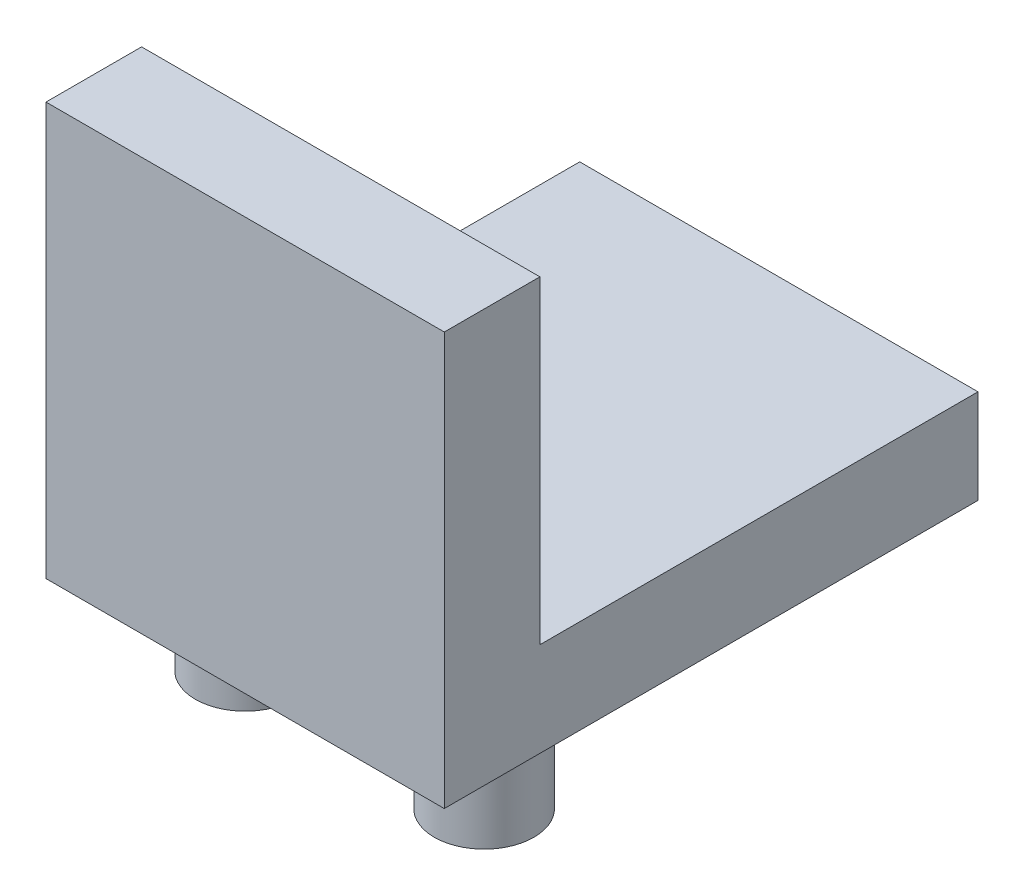
ISO-10303-21;
HEADER;
FILE_DESCRIPTION(('STEP AP214'),'2;1');
FILE_NAME('part.step','',(''),(''),'','','');
FILE_SCHEMA(('AUTOMOTIVE_DESIGN { 1 0 10303 214 1 1 1 1 }'));
ENDSEC;
DATA;
#1=APPLICATION_CONTEXT('core data for automotive mechanical design processes');
#2=APPLICATION_PROTOCOL_DEFINITION('international standard','automotive_design',2000,#1);
#3=PRODUCT_CONTEXT('',#1,'mechanical');
#4=PRODUCT('Part','Part','',(#3));
#5=PRODUCT_RELATED_PRODUCT_CATEGORY('part','',(#4));
#6=PRODUCT_DEFINITION_FORMATION('','',#4);
#7=PRODUCT_DEFINITION_CONTEXT('part definition',#1,'design');
#8=PRODUCT_DEFINITION('design','',#6,#7);
#9=PRODUCT_DEFINITION_SHAPE('','',#8);
#10=(LENGTH_UNIT() NAMED_UNIT(*) SI_UNIT(.MILLI.,.METRE.));
#11=(NAMED_UNIT(*) PLANE_ANGLE_UNIT() SI_UNIT($,.RADIAN.));
#12=(NAMED_UNIT(*) SI_UNIT($,.STERADIAN.) SOLID_ANGLE_UNIT());
#13=UNCERTAINTY_MEASURE_WITH_UNIT(LENGTH_MEASURE(1.E-05),#10,'distance_accuracy_value','');
#14=(GEOMETRIC_REPRESENTATION_CONTEXT(3) GLOBAL_UNCERTAINTY_ASSIGNED_CONTEXT((#13)) GLOBAL_UNIT_ASSIGNED_CONTEXT((#10,
#11,#12)) REPRESENTATION_CONTEXT('',''));
#15=CARTESIAN_POINT('',(0.,0.,0.));
#16=DIRECTION('',(0.,0.,1.));
#17=DIRECTION('',(1.,0.,0.));
#18=AXIS2_PLACEMENT_3D('',#15,#16,#17);
#19=CARTESIAN_POINT('',(-6.35,3.,-3.429));
#20=DIRECTION('',(1.,0.,0.));
#21=DIRECTION('',(0.,0.,-1.));
#22=AXIS2_PLACEMENT_3D('',#19,#20,#21);
#23=PLANE('',#22);
#24=DIRECTION('',(0.,0.,1.));
#25=VECTOR('',#24,1.);
#26=CARTESIAN_POINT('',(-6.35,13.16,3.429));
#27=LINE('',#26,#25);
#28=CARTESIAN_POINT('',(-6.35,13.16,0.381000000000002));
#29=VERTEX_POINT('',#28);
#30=CARTESIAN_POINT('',(-6.35,13.16,3.429));
#31=VERTEX_POINT('',#30);
#32=EDGE_CURVE('E111',#29,#31,#27,.T.);
#33=ORIENTED_EDGE('',*,*,#32,.F.);
#34=DIRECTION('',(0.,1.,0.));
#35=VECTOR('',#34,1.);
#36=CARTESIAN_POINT('',(-6.35,-9.72283946295009,0.381000000000001));
#37=LINE('',#36,#35);
#38=CARTESIAN_POINT('',(-6.35,3.,0.381000000000001));
#39=VERTEX_POINT('',#38);
#40=EDGE_CURVE('E48',#39,#29,#37,.T.);
#41=ORIENTED_EDGE('',*,*,#40,.F.);
#42=DIRECTION('',(0.,0.,1.));
#43=VECTOR('',#42,1.);
#44=CARTESIAN_POINT('',(-6.35,3.,-3.429));
#45=LINE('',#44,#43);
#46=CARTESIAN_POINT('',(-6.34999999999999,3.,-13.589));
#47=VERTEX_POINT('',#46);
#48=EDGE_CURVE('E118',#47,#39,#45,.T.);
#49=ORIENTED_EDGE('',*,*,#48,.F.);
#50=DIRECTION('',(0.,1.,0.));
#51=VECTOR('',#50,1.);
#52=CARTESIAN_POINT('',(-6.34999999999999,0.,-13.589));
#53=LINE('',#52,#51);
#54=CARTESIAN_POINT('',(-6.34999999999999,0.,-13.589));
#55=VERTEX_POINT('',#54);
#56=EDGE_CURVE('E158',#55,#47,#53,.T.);
#57=ORIENTED_EDGE('',*,*,#56,.F.);
#58=DIRECTION('',(0.,0.,1.));
#59=VECTOR('',#58,1.);
#60=CARTESIAN_POINT('',(-6.35,0.,-3.429));
#61=LINE('',#60,#59);
#62=CARTESIAN_POINT('',(-6.35,0.,3.429));
#63=VERTEX_POINT('',#62);
#64=EDGE_CURVE('E117',#55,#63,#61,.T.);
#65=ORIENTED_EDGE('',*,*,#64,.T.);
#66=DIRECTION('',(0.,-1.,0.));
#67=VECTOR('',#66,1.);
#68=CARTESIAN_POINT('',(-6.35,3.,3.429));
#69=LINE('',#68,#67);
#70=EDGE_CURVE('E128',#31,#63,#69,.T.);
#71=ORIENTED_EDGE('',*,*,#70,.F.);
#72=EDGE_LOOP('',(#33,#41,#49,#57,#65,#71));
#73=FACE_BOUND('',#72,.T.);
#74=ADVANCED_FACE('F34',(#73),#23,.F.);
#75=CARTESIAN_POINT('',(-6.35,3.,3.429));
#76=DIRECTION('',(0.,0.,-1.));
#77=DIRECTION('',(-1.,0.,0.));
#78=AXIS2_PLACEMENT_3D('',#75,#76,#77);
#79=PLANE('',#78);
#80=DIRECTION('',(1.,0.,0.));
#81=VECTOR('',#80,1.);
#82=CARTESIAN_POINT('',(-6.35,0.,3.429));
#83=LINE('',#82,#81);
#84=CARTESIAN_POINT('',(6.35,0.,3.429));
#85=VERTEX_POINT('',#84);
#86=EDGE_CURVE('E56',#63,#85,#83,.T.);
#87=ORIENTED_EDGE('',*,*,#86,.T.);
#88=DIRECTION('',(0.,-1.,0.));
#89=VECTOR('',#88,1.);
#90=CARTESIAN_POINT('',(6.35,3.,3.429));
#91=LINE('',#90,#89);
#92=CARTESIAN_POINT('',(6.35,13.16,3.429));
#93=VERTEX_POINT('',#92);
#94=EDGE_CURVE('E122',#93,#85,#91,.T.);
#95=ORIENTED_EDGE('',*,*,#94,.F.);
#96=DIRECTION('',(1.,0.,0.));
#97=VECTOR('',#96,1.);
#98=CARTESIAN_POINT('',(-6.35,13.16,3.429));
#99=LINE('',#98,#97);
#100=EDGE_CURVE('E105',#31,#93,#99,.T.);
#101=ORIENTED_EDGE('',*,*,#100,.F.);
#102=ORIENTED_EDGE('',*,*,#70,.T.);
#103=EDGE_LOOP('',(#87,#95,#101,#102));
#104=FACE_BOUND('',#103,.T.);
#105=ADVANCED_FACE('F166',(#104),#79,.F.);
#106=CARTESIAN_POINT('',(6.35,3.,3.429));
#107=DIRECTION('',(-1.,0.,0.));
#108=DIRECTION('',(0.,0.,1.));
#109=AXIS2_PLACEMENT_3D('',#106,#107,#108);
#110=PLANE('',#109);
#111=DIRECTION('',(0.,0.,-1.));
#112=VECTOR('',#111,1.);
#113=CARTESIAN_POINT('',(6.35,3.,3.429));
#114=LINE('',#113,#112);
#115=CARTESIAN_POINT('',(6.35,3.,0.381000000000001));
#116=VERTEX_POINT('',#115);
#117=CARTESIAN_POINT('',(6.35000000000001,3.,-13.589));
#118=VERTEX_POINT('',#117);
#119=EDGE_CURVE('E99',#116,#118,#114,.T.);
#120=ORIENTED_EDGE('',*,*,#119,.F.);
#121=DIRECTION('',(0.,1.,0.));
#122=VECTOR('',#121,1.);
#123=CARTESIAN_POINT('',(6.35,-9.72283946295009,0.381000000000001));
#124=LINE('',#123,#122);
#125=CARTESIAN_POINT('',(6.35,13.16,0.381000000000001));
#126=VERTEX_POINT('',#125);
#127=EDGE_CURVE('E88',#116,#126,#124,.T.);
#128=ORIENTED_EDGE('',*,*,#127,.T.);
#129=DIRECTION('',(0.,0.,-1.));
#130=VECTOR('',#129,1.);
#131=CARTESIAN_POINT('',(6.35,13.16,3.429));
#132=LINE('',#131,#130);
#133=EDGE_CURVE('E97',#93,#126,#132,.T.);
#134=ORIENTED_EDGE('',*,*,#133,.F.);
#135=ORIENTED_EDGE('',*,*,#94,.T.);
#136=DIRECTION('',(0.,0.,-1.));
#137=VECTOR('',#136,1.);
#138=CARTESIAN_POINT('',(6.35,0.,3.429));
#139=LINE('',#138,#137);
#140=CARTESIAN_POINT('',(6.35000000000001,0.,-13.589));
#141=VERTEX_POINT('',#140);
#142=EDGE_CURVE('E120',#85,#141,#139,.T.);
#143=ORIENTED_EDGE('',*,*,#142,.T.);
#144=DIRECTION('',(0.,-1.,0.));
#145=VECTOR('',#144,1.);
#146=CARTESIAN_POINT('',(6.35000000000001,3.,-13.589));
#147=LINE('',#146,#145);
#148=EDGE_CURVE('E160',#118,#141,#147,.T.);
#149=ORIENTED_EDGE('',*,*,#148,.F.);
#150=EDGE_LOOP('',(#120,#128,#134,#135,#143,#149));
#151=FACE_BOUND('',#150,.T.);
#152=ADVANCED_FACE('F96',(#151),#110,.F.);
#153=CARTESIAN_POINT('',(0.,3.,0.));
#154=DIRECTION('',(0.,1.,0.));
#155=DIRECTION('',(0.,0.,1.));
#156=AXIS2_PLACEMENT_3D('',#153,#154,#155);
#157=PLANE('',#156);
#158=ORIENTED_EDGE('',*,*,#48,.T.);
#159=DIRECTION('',(-1.,0.,0.));
#160=VECTOR('',#159,1.);
#161=CARTESIAN_POINT('',(0.,3.,0.381000000000001));
#162=LINE('',#161,#160);
#163=EDGE_CURVE('E100',#116,#39,#162,.T.);
#164=ORIENTED_EDGE('',*,*,#163,.F.);
#165=ORIENTED_EDGE('',*,*,#119,.T.);
#166=DIRECTION('',(1.,0.,0.));
#167=VECTOR('',#166,1.);
#168=CARTESIAN_POINT('',(-6.34999999999999,3.,-13.589));
#169=LINE('',#168,#167);
#170=EDGE_CURVE('E162',#47,#118,#169,.T.);
#171=ORIENTED_EDGE('',*,*,#170,.F.);
#172=EDGE_LOOP('',(#158,#164,#165,#171));
#173=FACE_BOUND('',#172,.T.);
#174=ADVANCED_FACE('F141',(#173),#157,.T.);
#175=CARTESIAN_POINT('',(0.,0.,0.));
#176=DIRECTION('',(0.,1.,0.));
#177=DIRECTION('',(0.,0.,1.));
#178=AXIS2_PLACEMENT_3D('',#175,#176,#177);
#179=PLANE('',#178);
#180=CARTESIAN_POINT('',(0.,0.,-8.001));
#181=DIRECTION('',(0.,1.,0.));
#182=DIRECTION('',(0.,0.,1.));
#183=AXIS2_PLACEMENT_3D('',#180,#181,#182);
#184=CIRCLE('',#183,1.5875);
#185=CARTESIAN_POINT('',(0.,0.,-6.4135));
#186=VERTEX_POINT('',#185);
#187=EDGE_CURVE('E11',#186,#186,#184,.F.);
#188=ORIENTED_EDGE('',*,*,#187,.F.);
#189=EDGE_LOOP('',(#188));
#190=FACE_BOUND('',#189,.T.);
#191=CARTESIAN_POINT('',(-3.81,0.,-0.380999999999999));
#192=DIRECTION('',(0.,1.,0.));
#193=DIRECTION('',(0.,0.,1.));
#194=AXIS2_PLACEMENT_3D('',#191,#192,#193);
#195=CIRCLE('',#194,1.5875);
#196=CARTESIAN_POINT('',(-3.81,0.,1.2065));
#197=VERTEX_POINT('',#196);
#198=EDGE_CURVE('E41',#197,#197,#195,.F.);
#199=ORIENTED_EDGE('',*,*,#198,.F.);
#200=EDGE_LOOP('',(#199));
#201=FACE_BOUND('',#200,.T.);
#202=CARTESIAN_POINT('',(3.81,0.,-0.381));
#203=DIRECTION('',(0.,1.,0.));
#204=DIRECTION('',(0.,0.,1.));
#205=AXIS2_PLACEMENT_3D('',#202,#203,#204);
#206=CIRCLE('',#205,1.5875);
#207=CARTESIAN_POINT('',(3.81,0.,1.2065));
#208=VERTEX_POINT('',#207);
#209=EDGE_CURVE('E130',#208,#208,#206,.F.);
#210=ORIENTED_EDGE('',*,*,#209,.F.);
#211=EDGE_LOOP('',(#210));
#212=FACE_BOUND('',#211,.T.);
#213=ORIENTED_EDGE('',*,*,#64,.F.);
#214=DIRECTION('',(-1.,0.,0.));
#215=VECTOR('',#214,1.);
#216=CARTESIAN_POINT('',(6.35000000000001,0.,-13.589));
#217=LINE('',#216,#215);
#218=EDGE_CURVE('E149',#141,#55,#217,.T.);
#219=ORIENTED_EDGE('',*,*,#218,.F.);
#220=ORIENTED_EDGE('',*,*,#142,.F.);
#221=ORIENTED_EDGE('',*,*,#86,.F.);
#222=EDGE_LOOP('',(#213,#219,#220,#221));
#223=FACE_BOUND('',#222,.T.);
#224=ADVANCED_FACE('F137',(#190,#201,#212,#223),#179,.F.);
#225=CARTESIAN_POINT('',(3.81,-3.175,-0.381));
#226=DIRECTION('',(0.,1.,0.));
#227=DIRECTION('',(0.,0.,1.));
#228=AXIS2_PLACEMENT_3D('',#225,#226,#227);
#229=CYLINDRICAL_SURFACE('',#228,1.5875);
#230=CARTESIAN_POINT('',(3.81,-3.175,-0.381));
#231=DIRECTION('',(0.,-1.,0.));
#232=DIRECTION('',(0.,0.,-1.));
#233=AXIS2_PLACEMENT_3D('',#230,#231,#232);
#234=CIRCLE('',#233,1.5875);
#235=CARTESIAN_POINT('',(3.81,-3.175,-1.9685));
#236=VERTEX_POINT('',#235);
#237=EDGE_CURVE('E109',#236,#236,#234,.T.);
#238=ORIENTED_EDGE('',*,*,#237,.F.);
#239=EDGE_LOOP('',(#238));
#240=FACE_BOUND('',#239,.T.);
#241=ORIENTED_EDGE('',*,*,#209,.T.);
#242=EDGE_LOOP('',(#241));
#243=FACE_BOUND('',#242,.T.);
#244=ADVANCED_FACE('F140',(#240,#243),#229,.T.);
#245=CARTESIAN_POINT('',(3.81,-3.175,-0.381));
#246=DIRECTION('',(0.,-1.,0.));
#247=DIRECTION('',(0.,0.,-1.));
#248=AXIS2_PLACEMENT_3D('',#245,#246,#247);
#249=PLANE('',#248);
#250=ORIENTED_EDGE('',*,*,#237,.T.);
#251=EDGE_LOOP('',(#250));
#252=FACE_BOUND('',#251,.T.);
#253=ADVANCED_FACE('F257',(#252),#249,.T.);
#254=CARTESIAN_POINT('',(-3.81,-3.175,-0.380999999999999));
#255=DIRECTION('',(0.,1.,0.));
#256=DIRECTION('',(0.,0.,1.));
#257=AXIS2_PLACEMENT_3D('',#254,#255,#256);
#258=CYLINDRICAL_SURFACE('',#257,1.5875);
#259=CARTESIAN_POINT('',(-3.81,-3.175,-0.380999999999999));
#260=DIRECTION('',(0.,-1.,0.));
#261=DIRECTION('',(0.,0.,-1.));
#262=AXIS2_PLACEMENT_3D('',#259,#260,#261);
#263=CIRCLE('',#262,1.5875);
#264=CARTESIAN_POINT('',(-3.81,-3.175,-1.9685));
#265=VERTEX_POINT('',#264);
#266=EDGE_CURVE('E106',#265,#265,#263,.T.);
#267=ORIENTED_EDGE('',*,*,#266,.F.);
#268=EDGE_LOOP('',(#267));
#269=FACE_BOUND('',#268,.T.);
#270=ORIENTED_EDGE('',*,*,#198,.T.);
#271=EDGE_LOOP('',(#270));
#272=FACE_BOUND('',#271,.T.);
#273=ADVANCED_FACE('F135',(#269,#272),#258,.T.);
#274=CARTESIAN_POINT('',(-3.81,-3.175,-0.380999999999999));
#275=DIRECTION('',(0.,-1.,0.));
#276=DIRECTION('',(0.,0.,-1.));
#277=AXIS2_PLACEMENT_3D('',#274,#275,#276);
#278=PLANE('',#277);
#279=ORIENTED_EDGE('',*,*,#266,.T.);
#280=EDGE_LOOP('',(#279));
#281=FACE_BOUND('',#280,.T.);
#282=ADVANCED_FACE('F212',(#281),#278,.T.);
#283=CARTESIAN_POINT('',(0.,13.16,0.));
#284=DIRECTION('',(0.,-1.,0.));
#285=DIRECTION('',(0.,0.,-1.));
#286=AXIS2_PLACEMENT_3D('',#283,#284,#285);
#287=PLANE('',#286);
#288=ORIENTED_EDGE('',*,*,#133,.T.);
#289=DIRECTION('',(1.,0.,0.));
#290=VECTOR('',#289,1.);
#291=CARTESIAN_POINT('',(0.,13.16,0.381000000000001));
#292=LINE('',#291,#290);
#293=EDGE_CURVE('E85',#29,#126,#292,.T.);
#294=ORIENTED_EDGE('',*,*,#293,.F.);
#295=ORIENTED_EDGE('',*,*,#32,.T.);
#296=ORIENTED_EDGE('',*,*,#100,.T.);
#297=EDGE_LOOP('',(#288,#294,#295,#296));
#298=FACE_BOUND('',#297,.T.);
#299=ADVANCED_FACE('F103',(#298),#287,.F.);
#300=CARTESIAN_POINT('',(0.,0.,-13.589));
#301=DIRECTION('',(0.,0.,-1.));
#302=DIRECTION('',(-1.,0.,0.));
#303=AXIS2_PLACEMENT_3D('',#300,#301,#302);
#304=PLANE('',#303);
#305=ORIENTED_EDGE('',*,*,#148,.T.);
#306=ORIENTED_EDGE('',*,*,#218,.T.);
#307=ORIENTED_EDGE('',*,*,#56,.T.);
#308=ORIENTED_EDGE('',*,*,#170,.T.);
#309=EDGE_LOOP('',(#305,#306,#307,#308));
#310=FACE_BOUND('',#309,.T.);
#311=ADVANCED_FACE('F156',(#310),#304,.T.);
#312=CARTESIAN_POINT('',(0.,-3.175,-8.001));
#313=DIRECTION('',(0.,1.,0.));
#314=DIRECTION('',(0.,0.,1.));
#315=AXIS2_PLACEMENT_3D('',#312,#313,#314);
#316=CYLINDRICAL_SURFACE('',#315,1.5875);
#317=CARTESIAN_POINT('',(0.,-3.175,-8.001));
#318=DIRECTION('',(0.,-1.,0.));
#319=DIRECTION('',(0.,0.,-1.));
#320=AXIS2_PLACEMENT_3D('',#317,#318,#319);
#321=CIRCLE('',#320,1.5875);
#322=CARTESIAN_POINT('',(0.,-3.175,-9.5885));
#323=VERTEX_POINT('',#322);
#324=EDGE_CURVE('E167',#323,#323,#321,.T.);
#325=ORIENTED_EDGE('',*,*,#324,.F.);
#326=EDGE_LOOP('',(#325));
#327=FACE_BOUND('',#326,.T.);
#328=ORIENTED_EDGE('',*,*,#187,.T.);
#329=EDGE_LOOP('',(#328));
#330=FACE_BOUND('',#329,.T.);
#331=ADVANCED_FACE('F230',(#327,#330),#316,.T.);
#332=CARTESIAN_POINT('',(0.,-3.175,0.));
#333=DIRECTION('',(0.,-1.,0.));
#334=DIRECTION('',(0.,0.,-1.));
#335=AXIS2_PLACEMENT_3D('',#332,#333,#334);
#336=PLANE('',#335);
#337=ORIENTED_EDGE('',*,*,#324,.T.);
#338=EDGE_LOOP('',(#337));
#339=FACE_BOUND('',#338,.T.);
#340=ADVANCED_FACE('F222',(#339),#336,.T.);
#341=CARTESIAN_POINT('',(0.,-9.72283946295009,0.381000000000001));
#342=DIRECTION('',(0.,0.,1.));
#343=DIRECTION('',(1.,0.,0.));
#344=AXIS2_PLACEMENT_3D('',#341,#342,#343);
#345=PLANE('',#344);
#346=ORIENTED_EDGE('',*,*,#163,.T.);
#347=ORIENTED_EDGE('',*,*,#40,.T.);
#348=ORIENTED_EDGE('',*,*,#293,.T.);
#349=ORIENTED_EDGE('',*,*,#127,.F.);
#350=EDGE_LOOP('',(#346,#347,#348,#349));
#351=FACE_BOUND('',#350,.T.);
#352=ADVANCED_FACE('F87',(#351),#345,.F.);
#353=CLOSED_SHELL('',(#74,#105,#152,#174,#224,#244,#253,#273,#282,#299,#311,#331,#340,#352));
#354=MANIFOLD_SOLID_BREP('B2',#353);
#355=ADVANCED_BREP_SHAPE_REPRESENTATION('',(#18,#354),#14);
#356=SHAPE_DEFINITION_REPRESENTATION(#9,#355);
ENDSEC;
END-ISO-10303-21;
